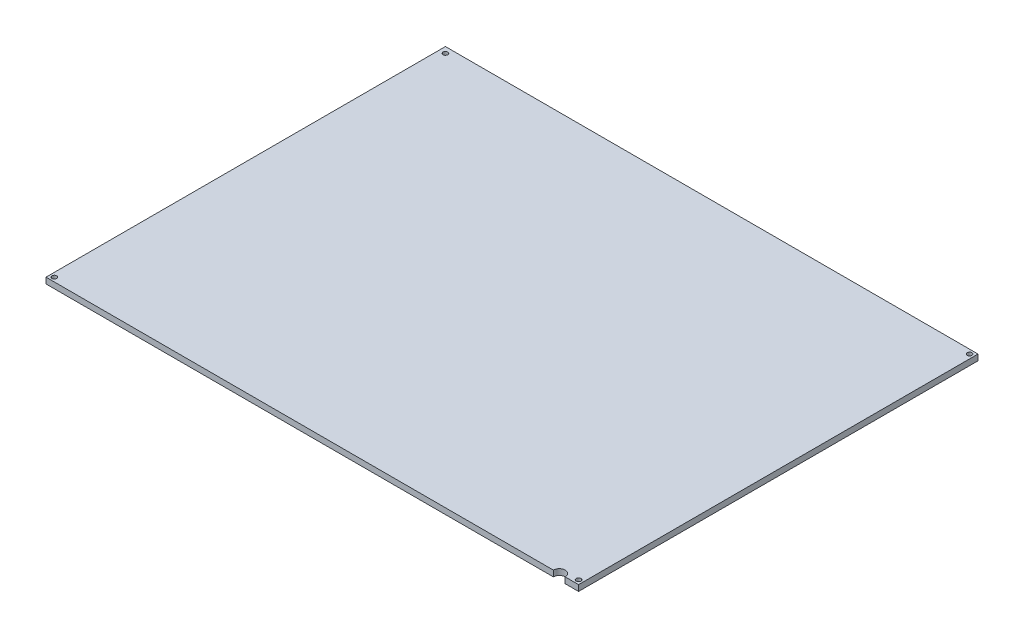
ISO-10303-21;
HEADER;
FILE_DESCRIPTION(('STEP AP214'),'2;1');
FILE_NAME('part.step','',(''),(''),'','','');
FILE_SCHEMA(('AUTOMOTIVE_DESIGN { 1 0 10303 214 1 1 1 1 }'));
ENDSEC;
DATA;
#1=APPLICATION_CONTEXT('core data for automotive mechanical design processes');
#2=APPLICATION_PROTOCOL_DEFINITION('international standard','automotive_design',2000,#1);
#3=PRODUCT_CONTEXT('',#1,'mechanical');
#4=PRODUCT('Part','Part','',(#3));
#5=PRODUCT_RELATED_PRODUCT_CATEGORY('part','',(#4));
#6=PRODUCT_DEFINITION_FORMATION('','',#4);
#7=PRODUCT_DEFINITION_CONTEXT('part definition',#1,'design');
#8=PRODUCT_DEFINITION('design','',#6,#7);
#9=PRODUCT_DEFINITION_SHAPE('','',#8);
#10=(LENGTH_UNIT() NAMED_UNIT(*) SI_UNIT(.MILLI.,.METRE.));
#11=(NAMED_UNIT(*) PLANE_ANGLE_UNIT() SI_UNIT($,.RADIAN.));
#12=(NAMED_UNIT(*) SI_UNIT($,.STERADIAN.) SOLID_ANGLE_UNIT());
#13=UNCERTAINTY_MEASURE_WITH_UNIT(LENGTH_MEASURE(1.E-05),#10,'distance_accuracy_value','');
#14=(GEOMETRIC_REPRESENTATION_CONTEXT(3) GLOBAL_UNCERTAINTY_ASSIGNED_CONTEXT((#13)) GLOBAL_UNIT_ASSIGNED_CONTEXT((#10,
#11,#12)) REPRESENTATION_CONTEXT('',''));
#15=CARTESIAN_POINT('',(0.,0.,0.));
#16=DIRECTION('',(0.,0.,1.));
#17=DIRECTION('',(1.,0.,0.));
#18=AXIS2_PLACEMENT_3D('',#15,#16,#17);
#19=CARTESIAN_POINT('',(-450.,10.,337.5));
#20=DIRECTION('',(0.,0.,-1.));
#21=DIRECTION('',(-1.,0.,0.));
#22=AXIS2_PLACEMENT_3D('',#19,#20,#21);
#23=PLANE('',#22);
#24=DIRECTION('',(1.,0.,0.));
#25=VECTOR('',#24,1.);
#26=CARTESIAN_POINT('',(-450.,0.,337.5));
#27=LINE('',#26,#25);
#28=CARTESIAN_POINT('',(-450.,0.,337.5));
#29=VERTEX_POINT('',#28);
#30=CARTESIAN_POINT('',(407.383273443857,0.,337.5));
#31=VERTEX_POINT('',#30);
#32=EDGE_CURVE('E107',#29,#31,#27,.T.);
#33=ORIENTED_EDGE('',*,*,#32,.T.);
#34=DIRECTION('',(0.,1.,0.));
#35=VECTOR('',#34,1.);
#36=CARTESIAN_POINT('',(407.383273443857,0.,337.5));
#37=LINE('',#36,#35);
#38=CARTESIAN_POINT('',(407.383273443857,10.,337.5));
#39=VERTEX_POINT('',#38);
#40=EDGE_CURVE('E48',#31,#39,#37,.T.);
#41=ORIENTED_EDGE('',*,*,#40,.T.);
#42=DIRECTION('',(1.,0.,0.));
#43=VECTOR('',#42,1.);
#44=CARTESIAN_POINT('',(-450.,10.,337.5));
#45=LINE('',#44,#43);
#46=CARTESIAN_POINT('',(-450.,10.,337.5));
#47=VERTEX_POINT('',#46);
#48=EDGE_CURVE('E118',#47,#39,#45,.T.);
#49=ORIENTED_EDGE('',*,*,#48,.F.);
#50=DIRECTION('',(0.,-1.,0.));
#51=VECTOR('',#50,1.);
#52=CARTESIAN_POINT('',(-450.,10.,337.5));
#53=LINE('',#52,#51);
#54=EDGE_CURVE('E117',#47,#29,#53,.T.);
#55=ORIENTED_EDGE('',*,*,#54,.T.);
#56=EDGE_LOOP('',(#33,#41,#49,#55));
#57=FACE_BOUND('',#56,.T.);
#58=ADVANCED_FACE('F33',(#57),#23,.F.);
#59=CARTESIAN_POINT('',(450.,10.,-337.5));
#60=DIRECTION('',(-1.,0.,0.));
#61=DIRECTION('',(0.,0.,1.));
#62=AXIS2_PLACEMENT_3D('',#59,#60,#61);
#63=PLANE('',#62);
#64=DIRECTION('',(0.,0.,-1.));
#65=VECTOR('',#64,1.);
#66=CARTESIAN_POINT('',(450.,0.,-337.5));
#67=LINE('',#66,#65);
#68=CARTESIAN_POINT('',(450.,0.,337.5));
#69=VERTEX_POINT('',#68);
#70=CARTESIAN_POINT('',(450.,0.,-337.5));
#71=VERTEX_POINT('',#70);
#72=EDGE_CURVE('E106',#69,#71,#67,.T.);
#73=ORIENTED_EDGE('',*,*,#72,.T.);
#74=DIRECTION('',(0.,-1.,0.));
#75=VECTOR('',#74,1.);
#76=CARTESIAN_POINT('',(450.,10.,-337.5));
#77=LINE('',#76,#75);
#78=CARTESIAN_POINT('',(450.,10.,-337.5));
#79=VERTEX_POINT('',#78);
#80=EDGE_CURVE('E11',#79,#71,#77,.T.);
#81=ORIENTED_EDGE('',*,*,#80,.F.);
#82=DIRECTION('',(0.,0.,-1.));
#83=VECTOR('',#82,1.);
#84=CARTESIAN_POINT('',(450.,10.,-337.5));
#85=LINE('',#84,#83);
#86=CARTESIAN_POINT('',(450.,10.,337.5));
#87=VERTEX_POINT('',#86);
#88=EDGE_CURVE('E110',#87,#79,#85,.T.);
#89=ORIENTED_EDGE('',*,*,#88,.F.);
#90=DIRECTION('',(0.,-1.,0.));
#91=VECTOR('',#90,1.);
#92=CARTESIAN_POINT('',(450.,10.,337.5));
#93=LINE('',#92,#91);
#94=EDGE_CURVE('E115',#87,#69,#93,.T.);
#95=ORIENTED_EDGE('',*,*,#94,.T.);
#96=EDGE_LOOP('',(#73,#81,#89,#95));
#97=FACE_BOUND('',#96,.T.);
#98=ADVANCED_FACE('F35',(#97),#63,.F.);
#99=CARTESIAN_POINT('',(-450.,10.,-337.5));
#100=DIRECTION('',(0.,0.,1.));
#101=DIRECTION('',(1.,0.,0.));
#102=AXIS2_PLACEMENT_3D('',#99,#100,#101);
#103=PLANE('',#102);
#104=DIRECTION('',(-1.,0.,0.));
#105=VECTOR('',#104,1.);
#106=CARTESIAN_POINT('',(-450.,0.,-337.5));
#107=LINE('',#106,#105);
#108=CARTESIAN_POINT('',(-450.,0.,-337.5));
#109=VERTEX_POINT('',#108);
#110=EDGE_CURVE('E111',#71,#109,#107,.T.);
#111=ORIENTED_EDGE('',*,*,#110,.T.);
#112=DIRECTION('',(0.,-1.,0.));
#113=VECTOR('',#112,1.);
#114=CARTESIAN_POINT('',(-450.,10.,-337.5));
#115=LINE('',#114,#113);
#116=CARTESIAN_POINT('',(-450.,10.,-337.5));
#117=VERTEX_POINT('',#116);
#118=EDGE_CURVE('E41',#117,#109,#115,.T.);
#119=ORIENTED_EDGE('',*,*,#118,.F.);
#120=DIRECTION('',(-1.,0.,0.));
#121=VECTOR('',#120,1.);
#122=CARTESIAN_POINT('',(-450.,10.,-337.5));
#123=LINE('',#122,#121);
#124=EDGE_CURVE('E86',#79,#117,#123,.T.);
#125=ORIENTED_EDGE('',*,*,#124,.F.);
#126=ORIENTED_EDGE('',*,*,#80,.T.);
#127=EDGE_LOOP('',(#111,#119,#125,#126));
#128=FACE_BOUND('',#127,.T.);
#129=ADVANCED_FACE('F135',(#128),#103,.F.);
#130=CARTESIAN_POINT('',(-450.,10.,-337.5));
#131=DIRECTION('',(1.,0.,0.));
#132=DIRECTION('',(0.,0.,-1.));
#133=AXIS2_PLACEMENT_3D('',#130,#131,#132);
#134=PLANE('',#133);
#135=DIRECTION('',(0.,0.,1.));
#136=VECTOR('',#135,1.);
#137=CARTESIAN_POINT('',(-450.,0.,-337.5));
#138=LINE('',#137,#136);
#139=EDGE_CURVE('E108',#109,#29,#138,.T.);
#140=ORIENTED_EDGE('',*,*,#139,.T.);
#141=ORIENTED_EDGE('',*,*,#54,.F.);
#142=DIRECTION('',(0.,0.,1.));
#143=VECTOR('',#142,1.);
#144=CARTESIAN_POINT('',(-450.,10.,-337.5));
#145=LINE('',#144,#143);
#146=EDGE_CURVE('E126',#117,#47,#145,.T.);
#147=ORIENTED_EDGE('',*,*,#146,.F.);
#148=ORIENTED_EDGE('',*,*,#118,.T.);
#149=EDGE_LOOP('',(#140,#141,#147,#148));
#150=FACE_BOUND('',#149,.T.);
#151=ADVANCED_FACE('F124',(#150),#134,.F.);
#152=CARTESIAN_POINT('',(427.383273443857,10.,337.5));
#153=VERTEX_POINT('',#152);
#154=EDGE_CURVE('E57',#153,#87,#45,.T.);
#155=ORIENTED_EDGE('',*,*,#154,.F.);
#156=DIRECTION('',(0.,1.,0.));
#157=VECTOR('',#156,1.);
#158=CARTESIAN_POINT('',(427.383273443857,0.,337.5));
#159=LINE('',#158,#157);
#160=CARTESIAN_POINT('',(427.383273443857,0.,337.5));
#161=VERTEX_POINT('',#160);
#162=EDGE_CURVE('E95',#153,#161,#159,.F.);
#163=ORIENTED_EDGE('',*,*,#162,.T.);
#164=EDGE_CURVE('E79',#161,#69,#27,.T.);
#165=ORIENTED_EDGE('',*,*,#164,.T.);
#166=ORIENTED_EDGE('',*,*,#94,.F.);
#167=EDGE_LOOP('',(#155,#163,#165,#166));
#168=FACE_BOUND('',#167,.T.);
#169=ADVANCED_FACE('F101',(#168),#23,.F.);
#170=CARTESIAN_POINT('',(0.,10.,0.));
#171=DIRECTION('',(0.,1.,0.));
#172=DIRECTION('',(0.,0.,1.));
#173=AXIS2_PLACEMENT_3D('',#170,#171,#172);
#174=PLANE('',#173);
#175=CARTESIAN_POINT('',(417.383273443857,10.,337.5));
#176=DIRECTION('',(0.,1.,0.));
#177=DIRECTION('',(0.,0.,1.));
#178=AXIS2_PLACEMENT_3D('',#175,#176,#177);
#179=CIRCLE('',#178,10.);
#180=EDGE_CURVE('E99',#153,#39,#179,.T.);
#181=ORIENTED_EDGE('',*,*,#180,.F.);
#182=ORIENTED_EDGE('',*,*,#154,.T.);
#183=ORIENTED_EDGE('',*,*,#88,.T.);
#184=ORIENTED_EDGE('',*,*,#124,.T.);
#185=ORIENTED_EDGE('',*,*,#146,.T.);
#186=ORIENTED_EDGE('',*,*,#48,.T.);
#187=EDGE_LOOP('',(#181,#182,#183,#184,#185,#186));
#188=FACE_BOUND('',#187,.T.);
#189=CARTESIAN_POINT('',(442.928932188135,10.,330.428932188135));
#190=DIRECTION('',(0.,1.,0.));
#191=DIRECTION('',(0.,0.,1.));
#192=AXIS2_PLACEMENT_3D('',#189,#190,#191);
#193=CIRCLE('',#192,3.99999999999999);
#194=CARTESIAN_POINT('',(442.928932188135,10.,334.428932188135));
#195=VERTEX_POINT('',#194);
#196=EDGE_CURVE('E159',#195,#195,#193,.T.);
#197=ORIENTED_EDGE('',*,*,#196,.F.);
#198=EDGE_LOOP('',(#197));
#199=FACE_BOUND('',#198,.T.);
#200=CARTESIAN_POINT('',(442.928932188135,10.,-330.428932188135));
#201=DIRECTION('',(0.,1.,0.));
#202=DIRECTION('',(0.,0.,1.));
#203=AXIS2_PLACEMENT_3D('',#200,#201,#202);
#204=CIRCLE('',#203,3.99999999999999);
#205=CARTESIAN_POINT('',(442.928932188135,10.,-326.428932188135));
#206=VERTEX_POINT('',#205);
#207=EDGE_CURVE('E153',#206,#206,#204,.T.);
#208=ORIENTED_EDGE('',*,*,#207,.F.);
#209=EDGE_LOOP('',(#208));
#210=FACE_BOUND('',#209,.T.);
#211=CARTESIAN_POINT('',(-442.928932188134,10.,330.428932188135));
#212=DIRECTION('',(0.,1.,0.));
#213=DIRECTION('',(0.,0.,1.));
#214=AXIS2_PLACEMENT_3D('',#211,#212,#213);
#215=CIRCLE('',#214,3.99999999999999);
#216=CARTESIAN_POINT('',(-442.928932188134,10.,334.428932188135));
#217=VERTEX_POINT('',#216);
#218=EDGE_CURVE('E147',#217,#217,#215,.T.);
#219=ORIENTED_EDGE('',*,*,#218,.F.);
#220=EDGE_LOOP('',(#219));
#221=FACE_BOUND('',#220,.T.);
#222=CARTESIAN_POINT('',(-440.,10.,-327.5));
#223=DIRECTION('',(0.,1.,0.));
#224=DIRECTION('',(0.,0.,1.));
#225=AXIS2_PLACEMENT_3D('',#222,#223,#224);
#226=CIRCLE('',#225,3.99999999999999);
#227=CARTESIAN_POINT('',(-440.,10.,-323.5));
#228=VERTEX_POINT('',#227);
#229=EDGE_CURVE('E141',#228,#228,#226,.T.);
#230=ORIENTED_EDGE('',*,*,#229,.F.);
#231=EDGE_LOOP('',(#230));
#232=FACE_BOUND('',#231,.T.);
#233=ADVANCED_FACE('F165',(#188,#199,#210,#221,#232),#174,.T.);
#234=CARTESIAN_POINT('',(0.,0.,0.));
#235=DIRECTION('',(0.,1.,0.));
#236=DIRECTION('',(0.,0.,1.));
#237=AXIS2_PLACEMENT_3D('',#234,#235,#236);
#238=PLANE('',#237);
#239=CARTESIAN_POINT('',(442.928932188135,0.,330.428932188135));
#240=DIRECTION('',(0.,1.,0.));
#241=DIRECTION('',(0.,0.,1.));
#242=AXIS2_PLACEMENT_3D('',#239,#240,#241);
#243=CIRCLE('',#242,3.99999999999999);
#244=CARTESIAN_POINT('',(442.928932188135,0.,334.428932188135));
#245=VERTEX_POINT('',#244);
#246=EDGE_CURVE('E156',#245,#245,#243,.T.);
#247=ORIENTED_EDGE('',*,*,#246,.T.);
#248=EDGE_LOOP('',(#247));
#249=FACE_BOUND('',#248,.T.);
#250=CARTESIAN_POINT('',(442.928932188135,0.,-330.428932188135));
#251=DIRECTION('',(0.,1.,0.));
#252=DIRECTION('',(0.,0.,1.));
#253=AXIS2_PLACEMENT_3D('',#250,#251,#252);
#254=CIRCLE('',#253,3.99999999999999);
#255=CARTESIAN_POINT('',(442.928932188135,0.,-326.428932188135));
#256=VERTEX_POINT('',#255);
#257=EDGE_CURVE('E150',#256,#256,#254,.T.);
#258=ORIENTED_EDGE('',*,*,#257,.T.);
#259=EDGE_LOOP('',(#258));
#260=FACE_BOUND('',#259,.T.);
#261=CARTESIAN_POINT('',(-442.928932188134,0.,330.428932188135));
#262=DIRECTION('',(0.,1.,0.));
#263=DIRECTION('',(0.,0.,1.));
#264=AXIS2_PLACEMENT_3D('',#261,#262,#263);
#265=CIRCLE('',#264,3.99999999999999);
#266=CARTESIAN_POINT('',(-442.928932188134,0.,334.428932188135));
#267=VERTEX_POINT('',#266);
#268=EDGE_CURVE('E144',#267,#267,#265,.T.);
#269=ORIENTED_EDGE('',*,*,#268,.T.);
#270=EDGE_LOOP('',(#269));
#271=FACE_BOUND('',#270,.T.);
#272=CARTESIAN_POINT('',(-440.,0.,-327.5));
#273=DIRECTION('',(0.,1.,0.));
#274=DIRECTION('',(0.,0.,1.));
#275=AXIS2_PLACEMENT_3D('',#272,#273,#274);
#276=CIRCLE('',#275,3.99999999999999);
#277=CARTESIAN_POINT('',(-440.,0.,-323.5));
#278=VERTEX_POINT('',#277);
#279=EDGE_CURVE('E134',#278,#278,#276,.T.);
#280=ORIENTED_EDGE('',*,*,#279,.T.);
#281=EDGE_LOOP('',(#280));
#282=FACE_BOUND('',#281,.T.);
#283=ORIENTED_EDGE('',*,*,#164,.F.);
#284=CARTESIAN_POINT('',(417.383273443857,0.,337.5));
#285=DIRECTION('',(0.,1.,0.));
#286=DIRECTION('',(0.,0.,1.));
#287=AXIS2_PLACEMENT_3D('',#284,#285,#286);
#288=CIRCLE('',#287,10.);
#289=EDGE_CURVE('E93',#161,#31,#288,.T.);
#290=ORIENTED_EDGE('',*,*,#289,.T.);
#291=ORIENTED_EDGE('',*,*,#32,.F.);
#292=ORIENTED_EDGE('',*,*,#139,.F.);
#293=ORIENTED_EDGE('',*,*,#110,.F.);
#294=ORIENTED_EDGE('',*,*,#72,.F.);
#295=EDGE_LOOP('',(#283,#290,#291,#292,#293,#294));
#296=FACE_BOUND('',#295,.T.);
#297=ADVANCED_FACE('F104',(#249,#260,#271,#282,#296),#238,.F.);
#298=CARTESIAN_POINT('',(-440.,0.,-327.5));
#299=DIRECTION('',(0.,1.,0.));
#300=DIRECTION('',(0.,0.,1.));
#301=AXIS2_PLACEMENT_3D('',#298,#299,#300);
#302=CYLINDRICAL_SURFACE('',#301,3.99999999999999);
#303=ORIENTED_EDGE('',*,*,#279,.F.);
#304=EDGE_LOOP('',(#303));
#305=FACE_BOUND('',#304,.T.);
#306=ORIENTED_EDGE('',*,*,#229,.T.);
#307=EDGE_LOOP('',(#306));
#308=FACE_BOUND('',#307,.T.);
#309=ADVANCED_FACE('F177',(#305,#308),#302,.F.);
#310=CARTESIAN_POINT('',(-442.928932188134,0.,330.428932188135));
#311=DIRECTION('',(0.,1.,0.));
#312=DIRECTION('',(0.,0.,1.));
#313=AXIS2_PLACEMENT_3D('',#310,#311,#312);
#314=CYLINDRICAL_SURFACE('',#313,3.99999999999999);
#315=ORIENTED_EDGE('',*,*,#268,.F.);
#316=EDGE_LOOP('',(#315));
#317=FACE_BOUND('',#316,.T.);
#318=ORIENTED_EDGE('',*,*,#218,.T.);
#319=EDGE_LOOP('',(#318));
#320=FACE_BOUND('',#319,.T.);
#321=ADVANCED_FACE('F179',(#317,#320),#314,.F.);
#322=CARTESIAN_POINT('',(442.928932188135,0.,-330.428932188135));
#323=DIRECTION('',(0.,1.,0.));
#324=DIRECTION('',(0.,0.,1.));
#325=AXIS2_PLACEMENT_3D('',#322,#323,#324);
#326=CYLINDRICAL_SURFACE('',#325,3.99999999999999);
#327=ORIENTED_EDGE('',*,*,#257,.F.);
#328=EDGE_LOOP('',(#327));
#329=FACE_BOUND('',#328,.T.);
#330=ORIENTED_EDGE('',*,*,#207,.T.);
#331=EDGE_LOOP('',(#330));
#332=FACE_BOUND('',#331,.T.);
#333=ADVANCED_FACE('F186',(#329,#332),#326,.F.);
#334=CARTESIAN_POINT('',(442.928932188135,0.,330.428932188135));
#335=DIRECTION('',(0.,1.,0.));
#336=DIRECTION('',(0.,0.,1.));
#337=AXIS2_PLACEMENT_3D('',#334,#335,#336);
#338=CYLINDRICAL_SURFACE('',#337,3.99999999999999);
#339=ORIENTED_EDGE('',*,*,#246,.F.);
#340=EDGE_LOOP('',(#339));
#341=FACE_BOUND('',#340,.T.);
#342=ORIENTED_EDGE('',*,*,#196,.T.);
#343=EDGE_LOOP('',(#342));
#344=FACE_BOUND('',#343,.T.);
#345=ADVANCED_FACE('F251',(#341,#344),#338,.F.);
#346=CARTESIAN_POINT('',(417.383273443857,0.,337.5));
#347=DIRECTION('',(0.,1.,0.));
#348=DIRECTION('',(0.,0.,1.));
#349=AXIS2_PLACEMENT_3D('',#346,#347,#348);
#350=CYLINDRICAL_SURFACE('',#349,10.);
#351=ORIENTED_EDGE('',*,*,#289,.F.);
#352=ORIENTED_EDGE('',*,*,#162,.F.);
#353=ORIENTED_EDGE('',*,*,#180,.T.);
#354=ORIENTED_EDGE('',*,*,#40,.F.);
#355=EDGE_LOOP('',(#351,#352,#353,#354));
#356=FACE_BOUND('',#355,.T.);
#357=ADVANCED_FACE('F94',(#356),#350,.F.);
#358=CLOSED_SHELL('',(#58,#98,#129,#151,#169,#233,#297,#309,#321,#333,#345,#357));
#359=MANIFOLD_SOLID_BREP('B2',#358);
#360=ADVANCED_BREP_SHAPE_REPRESENTATION('',(#18,#359),#14);
#361=SHAPE_DEFINITION_REPRESENTATION(#9,#360);
ENDSEC;
END-ISO-10303-21;
